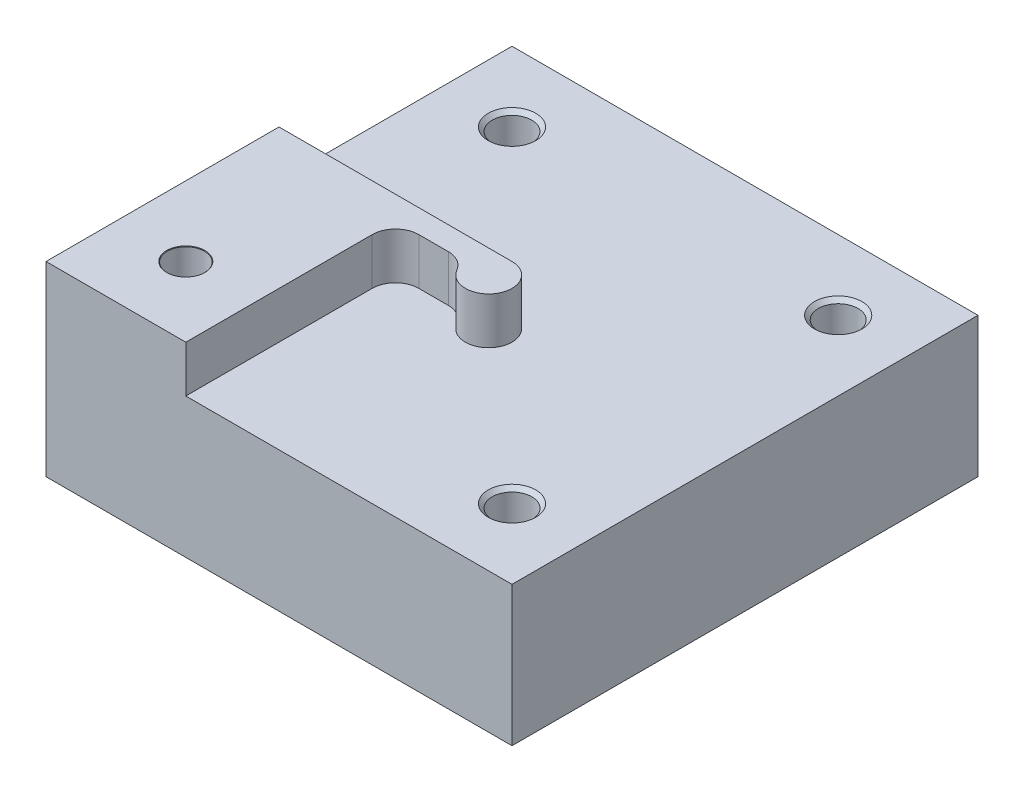
ISO-10303-21;
HEADER;
FILE_DESCRIPTION(('STEP AP214'),'2;1');
FILE_NAME('part.step','',(''),(''),'','','');
FILE_SCHEMA(('AUTOMOTIVE_DESIGN { 1 0 10303 214 1 1 1 1 }'));
ENDSEC;
DATA;
#1=APPLICATION_CONTEXT('core data for automotive mechanical design processes');
#2=APPLICATION_PROTOCOL_DEFINITION('international standard','automotive_design',2000,#1);
#3=PRODUCT_CONTEXT('',#1,'mechanical');
#4=PRODUCT('Part','Part','',(#3));
#5=PRODUCT_RELATED_PRODUCT_CATEGORY('part','',(#4));
#6=PRODUCT_DEFINITION_FORMATION('','',#4);
#7=PRODUCT_DEFINITION_CONTEXT('part definition',#1,'design');
#8=PRODUCT_DEFINITION('design','',#6,#7);
#9=PRODUCT_DEFINITION_SHAPE('','',#8);
#10=(LENGTH_UNIT() NAMED_UNIT(*) SI_UNIT(.MILLI.,.METRE.));
#11=(NAMED_UNIT(*) PLANE_ANGLE_UNIT() SI_UNIT($,.RADIAN.));
#12=(NAMED_UNIT(*) SI_UNIT($,.STERADIAN.) SOLID_ANGLE_UNIT());
#13=UNCERTAINTY_MEASURE_WITH_UNIT(LENGTH_MEASURE(1.E-05),#10,'distance_accuracy_value','');
#14=(GEOMETRIC_REPRESENTATION_CONTEXT(3) GLOBAL_UNCERTAINTY_ASSIGNED_CONTEXT((#13)) GLOBAL_UNIT_ASSIGNED_CONTEXT((#10,
#11,#12)) REPRESENTATION_CONTEXT('',''));
#15=CARTESIAN_POINT('',(0.,0.,0.));
#16=DIRECTION('',(0.,0.,1.));
#17=DIRECTION('',(1.,0.,0.));
#18=AXIS2_PLACEMENT_3D('',#15,#16,#17);
#19=CARTESIAN_POINT('',(-50.,30.,-50.));
#20=DIRECTION('',(1.,0.,0.));
#21=DIRECTION('',(0.,0.,-1.));
#22=AXIS2_PLACEMENT_3D('',#19,#20,#21);
#23=PLANE('',#22);
#24=DIRECTION('',(0.,0.,1.));
#25=VECTOR('',#24,1.);
#26=CARTESIAN_POINT('',(-50.,0.,-50.));
#27=LINE('',#26,#25);
#28=CARTESIAN_POINT('',(-50.,0.,-50.));
#29=VERTEX_POINT('',#28);
#30=CARTESIAN_POINT('',(-50.,0.,50.));
#31=VERTEX_POINT('',#30);
#32=EDGE_CURVE('E143',#29,#31,#27,.T.);
#33=ORIENTED_EDGE('',*,*,#32,.T.);
#34=DIRECTION('',(0.,-1.,0.));
#35=VECTOR('',#34,1.);
#36=CARTESIAN_POINT('',(-50.,30.,50.));
#37=LINE('',#36,#35);
#38=CARTESIAN_POINT('',(-50.,40.,50.));
#39=VERTEX_POINT('',#38);
#40=EDGE_CURVE('E173',#39,#31,#37,.T.);
#41=ORIENTED_EDGE('',*,*,#40,.F.);
#42=DIRECTION('',(0.,0.,1.));
#43=VECTOR('',#42,1.);
#44=CARTESIAN_POINT('',(-50.,40.,50.));
#45=LINE('',#44,#43);
#46=CARTESIAN_POINT('',(-50.,40.,0.));
#47=VERTEX_POINT('',#46);
#48=EDGE_CURVE('E135',#47,#39,#45,.T.);
#49=ORIENTED_EDGE('',*,*,#48,.F.);
#50=DIRECTION('',(0.,-1.,0.));
#51=VECTOR('',#50,1.);
#52=CARTESIAN_POINT('',(-50.,40.,0.));
#53=LINE('',#52,#51);
#54=CARTESIAN_POINT('',(-50.,30.,0.));
#55=VERTEX_POINT('',#54);
#56=EDGE_CURVE('E267',#47,#55,#53,.T.);
#57=ORIENTED_EDGE('',*,*,#56,.T.);
#58=DIRECTION('',(0.,0.,1.));
#59=VECTOR('',#58,1.);
#60=CARTESIAN_POINT('',(-50.,30.,-50.));
#61=LINE('',#60,#59);
#62=CARTESIAN_POINT('',(-50.,30.,-50.));
#63=VERTEX_POINT('',#62);
#64=EDGE_CURVE('E152',#63,#55,#61,.T.);
#65=ORIENTED_EDGE('',*,*,#64,.F.);
#66=DIRECTION('',(0.,-1.,0.));
#67=VECTOR('',#66,1.);
#68=CARTESIAN_POINT('',(-50.,30.,-50.));
#69=LINE('',#68,#67);
#70=EDGE_CURVE('E159',#63,#29,#69,.T.);
#71=ORIENTED_EDGE('',*,*,#70,.T.);
#72=EDGE_LOOP('',(#33,#41,#49,#57,#65,#71));
#73=FACE_BOUND('',#72,.T.);
#74=ADVANCED_FACE('F37',(#73),#23,.F.);
#75=CARTESIAN_POINT('',(-50.,30.,50.));
#76=DIRECTION('',(0.,0.,-1.));
#77=DIRECTION('',(-1.,0.,0.));
#78=AXIS2_PLACEMENT_3D('',#75,#76,#77);
#79=PLANE('',#78);
#80=DIRECTION('',(1.,0.,0.));
#81=VECTOR('',#80,1.);
#82=CARTESIAN_POINT('',(-50.,0.,50.));
#83=LINE('',#82,#81);
#84=CARTESIAN_POINT('',(50.,0.,50.));
#85=VERTEX_POINT('',#84);
#86=EDGE_CURVE('E146',#31,#85,#83,.T.);
#87=ORIENTED_EDGE('',*,*,#86,.T.);
#88=DIRECTION('',(0.,-1.,0.));
#89=VECTOR('',#88,1.);
#90=CARTESIAN_POINT('',(50.,30.,50.));
#91=LINE('',#90,#89);
#92=CARTESIAN_POINT('',(50.,30.,50.));
#93=VERTEX_POINT('',#92);
#94=EDGE_CURVE('E170',#93,#85,#91,.T.);
#95=ORIENTED_EDGE('',*,*,#94,.F.);
#96=DIRECTION('',(1.,0.,0.));
#97=VECTOR('',#96,1.);
#98=CARTESIAN_POINT('',(-50.,30.,50.));
#99=LINE('',#98,#97);
#100=CARTESIAN_POINT('',(-20.,30.,50.));
#101=VERTEX_POINT('',#100);
#102=EDGE_CURVE('E142',#101,#93,#99,.T.);
#103=ORIENTED_EDGE('',*,*,#102,.F.);
#104=DIRECTION('',(0.,-1.,0.));
#105=VECTOR('',#104,1.);
#106=CARTESIAN_POINT('',(-20.,40.,50.));
#107=LINE('',#106,#105);
#108=CARTESIAN_POINT('',(-20.,40.,50.));
#109=VERTEX_POINT('',#108);
#110=EDGE_CURVE('E123',#109,#101,#107,.T.);
#111=ORIENTED_EDGE('',*,*,#110,.F.);
#112=DIRECTION('',(1.,0.,0.));
#113=VECTOR('',#112,1.);
#114=CARTESIAN_POINT('',(-20.,40.,50.));
#115=LINE('',#114,#113);
#116=EDGE_CURVE('E129',#39,#109,#115,.T.);
#117=ORIENTED_EDGE('',*,*,#116,.F.);
#118=ORIENTED_EDGE('',*,*,#40,.T.);
#119=EDGE_LOOP('',(#87,#95,#103,#111,#117,#118));
#120=FACE_BOUND('',#119,.T.);
#121=ADVANCED_FACE('F140',(#120),#79,.F.);
#122=CARTESIAN_POINT('',(50.,30.,-50.));
#123=DIRECTION('',(-1.,0.,0.));
#124=DIRECTION('',(0.,0.,1.));
#125=AXIS2_PLACEMENT_3D('',#122,#123,#124);
#126=PLANE('',#125);
#127=DIRECTION('',(0.,0.,-1.));
#128=VECTOR('',#127,1.);
#129=CARTESIAN_POINT('',(50.,0.,-50.));
#130=LINE('',#129,#128);
#131=CARTESIAN_POINT('',(50.,0.,-50.));
#132=VERTEX_POINT('',#131);
#133=EDGE_CURVE('E162',#85,#132,#130,.T.);
#134=ORIENTED_EDGE('',*,*,#133,.T.);
#135=DIRECTION('',(0.,-1.,0.));
#136=VECTOR('',#135,1.);
#137=CARTESIAN_POINT('',(50.,30.,-50.));
#138=LINE('',#137,#136);
#139=CARTESIAN_POINT('',(50.,30.,-50.));
#140=VERTEX_POINT('',#139);
#141=EDGE_CURVE('E167',#140,#132,#138,.T.);
#142=ORIENTED_EDGE('',*,*,#141,.F.);
#143=DIRECTION('',(0.,0.,-1.));
#144=VECTOR('',#143,1.);
#145=CARTESIAN_POINT('',(50.,30.,-50.));
#146=LINE('',#145,#144);
#147=EDGE_CURVE('E156',#93,#140,#146,.T.);
#148=ORIENTED_EDGE('',*,*,#147,.F.);
#149=ORIENTED_EDGE('',*,*,#94,.T.);
#150=EDGE_LOOP('',(#134,#142,#148,#149));
#151=FACE_BOUND('',#150,.T.);
#152=ADVANCED_FACE('F213',(#151),#126,.F.);
#153=CARTESIAN_POINT('',(-50.,30.,-50.));
#154=DIRECTION('',(0.,0.,1.));
#155=DIRECTION('',(1.,0.,0.));
#156=AXIS2_PLACEMENT_3D('',#153,#154,#155);
#157=PLANE('',#156);
#158=DIRECTION('',(-1.,0.,0.));
#159=VECTOR('',#158,1.);
#160=CARTESIAN_POINT('',(-50.,0.,-50.));
#161=LINE('',#160,#159);
#162=EDGE_CURVE('E154',#132,#29,#161,.T.);
#163=ORIENTED_EDGE('',*,*,#162,.T.);
#164=ORIENTED_EDGE('',*,*,#70,.F.);
#165=DIRECTION('',(-1.,0.,0.));
#166=VECTOR('',#165,1.);
#167=CARTESIAN_POINT('',(-50.,30.,-50.));
#168=LINE('',#167,#166);
#169=EDGE_CURVE('E158',#140,#63,#168,.T.);
#170=ORIENTED_EDGE('',*,*,#169,.F.);
#171=ORIENTED_EDGE('',*,*,#141,.T.);
#172=EDGE_LOOP('',(#163,#164,#170,#171));
#173=FACE_BOUND('',#172,.T.);
#174=ADVANCED_FACE('F321',(#173),#157,.F.);
#175=CARTESIAN_POINT('',(0.,30.,0.));
#176=DIRECTION('',(0.,1.,0.));
#177=DIRECTION('',(0.,0.,1.));
#178=AXIS2_PLACEMENT_3D('',#175,#176,#177);
#179=PLANE('',#178);
#180=CARTESIAN_POINT('',(35.,30.,35.));
#181=DIRECTION('',(0.,1.,0.));
#182=DIRECTION('',(0.,0.,1.));
#183=AXIS2_PLACEMENT_3D('',#180,#181,#182);
#184=CIRCLE('',#183,5.09999999999999);
#185=CARTESIAN_POINT('',(35.,30.,40.1));
#186=VERTEX_POINT('',#185);
#187=EDGE_CURVE('E184',#186,#186,#184,.F.);
#188=ORIENTED_EDGE('',*,*,#187,.T.);
#189=EDGE_LOOP('',(#188));
#190=FACE_BOUND('',#189,.T.);
#191=CARTESIAN_POINT('',(35.,30.,-35.));
#192=DIRECTION('',(0.,1.,0.));
#193=DIRECTION('',(0.,0.,1.));
#194=AXIS2_PLACEMENT_3D('',#191,#192,#193);
#195=CIRCLE('',#194,5.09999999999999);
#196=CARTESIAN_POINT('',(35.,30.,-29.9));
#197=VERTEX_POINT('',#196);
#198=EDGE_CURVE('E181',#197,#197,#195,.F.);
#199=ORIENTED_EDGE('',*,*,#198,.T.);
#200=EDGE_LOOP('',(#199));
#201=FACE_BOUND('',#200,.T.);
#202=CARTESIAN_POINT('',(-35.,30.,-35.));
#203=DIRECTION('',(0.,1.,0.));
#204=DIRECTION('',(0.,0.,1.));
#205=AXIS2_PLACEMENT_3D('',#202,#203,#204);
#206=CIRCLE('',#205,5.09999999999999);
#207=CARTESIAN_POINT('',(-35.,30.,-29.9));
#208=VERTEX_POINT('',#207);
#209=EDGE_CURVE('E178',#208,#208,#206,.F.);
#210=ORIENTED_EDGE('',*,*,#209,.T.);
#211=EDGE_LOOP('',(#210));
#212=FACE_BOUND('',#211,.T.);
#213=DIRECTION('',(-1.,0.,0.));
#214=VECTOR('',#213,1.);
#215=CARTESIAN_POINT('',(-50.,30.,0.));
#216=LINE('',#215,#214);
#217=CARTESIAN_POINT('',(0.,30.,0.));
#218=VERTEX_POINT('',#217);
#219=EDGE_CURVE('E52',#218,#55,#216,.T.);
#220=ORIENTED_EDGE('',*,*,#219,.F.);
#221=CARTESIAN_POINT('',(0.,30.,5.));
#222=DIRECTION('',(0.,1.,0.));
#223=DIRECTION('',(0.,0.,-1.));
#224=AXIS2_PLACEMENT_3D('',#221,#222,#223);
#225=CIRCLE('',#224,5.);
#226=CARTESIAN_POINT('',(-4.3301270189222,30.,7.5));
#227=VERTEX_POINT('',#226);
#228=EDGE_CURVE('E56',#227,#218,#225,.T.);
#229=ORIENTED_EDGE('',*,*,#228,.F.);
#230=CARTESIAN_POINT('',(-8.66025403784439,30.,10.));
#231=DIRECTION('',(0.,-1.,0.));
#232=DIRECTION('',(0.,0.,1.));
#233=AXIS2_PLACEMENT_3D('',#230,#231,#232);
#234=CIRCLE('',#233,5.);
#235=CARTESIAN_POINT('',(-8.66025403784439,30.,5.));
#236=VERTEX_POINT('',#235);
#237=EDGE_CURVE('E275',#236,#227,#234,.T.);
#238=ORIENTED_EDGE('',*,*,#237,.F.);
#239=DIRECTION('',(1.,0.,0.));
#240=VECTOR('',#239,1.);
#241=CARTESIAN_POINT('',(-8.66025403784439,30.,5.));
#242=LINE('',#241,#240);
#243=CARTESIAN_POINT('',(-15.,30.,5.));
#244=VERTEX_POINT('',#243);
#245=EDGE_CURVE('E272',#244,#236,#242,.T.);
#246=ORIENTED_EDGE('',*,*,#245,.F.);
#247=CARTESIAN_POINT('',(-15.,30.,10.));
#248=DIRECTION('',(0.,-1.,0.));
#249=DIRECTION('',(0.,0.,1.));
#250=AXIS2_PLACEMENT_3D('',#247,#248,#249);
#251=CIRCLE('',#250,5.);
#252=CARTESIAN_POINT('',(-20.,30.,10.));
#253=VERTEX_POINT('',#252);
#254=EDGE_CURVE('E269',#253,#244,#251,.T.);
#255=ORIENTED_EDGE('',*,*,#254,.F.);
#256=DIRECTION('',(0.,0.,-1.));
#257=VECTOR('',#256,1.);
#258=CARTESIAN_POINT('',(-20.,30.,10.));
#259=LINE('',#258,#257);
#260=EDGE_CURVE('E250',#101,#253,#259,.T.);
#261=ORIENTED_EDGE('',*,*,#260,.F.);
#262=ORIENTED_EDGE('',*,*,#102,.T.);
#263=ORIENTED_EDGE('',*,*,#147,.T.);
#264=ORIENTED_EDGE('',*,*,#169,.T.);
#265=ORIENTED_EDGE('',*,*,#64,.T.);
#266=EDGE_LOOP('',(#220,#229,#238,#246,#255,#261,#262,#263,#264,#265));
#267=FACE_BOUND('',#266,.T.);
#268=ADVANCED_FACE('F297',(#190,#201,#212,#267),#179,.T.);
#269=CARTESIAN_POINT('',(0.,0.,0.));
#270=DIRECTION('',(0.,1.,0.));
#271=DIRECTION('',(0.,0.,1.));
#272=AXIS2_PLACEMENT_3D('',#269,#270,#271);
#273=PLANE('',#272);
#274=ORIENTED_EDGE('',*,*,#32,.F.);
#275=ORIENTED_EDGE('',*,*,#162,.F.);
#276=ORIENTED_EDGE('',*,*,#133,.F.);
#277=ORIENTED_EDGE('',*,*,#86,.F.);
#278=EDGE_LOOP('',(#274,#275,#276,#277));
#279=FACE_BOUND('',#278,.T.);
#280=ADVANCED_FACE('F318',(#279),#273,.F.);
#281=CARTESIAN_POINT('',(-20.,40.,10.));
#282=DIRECTION('',(-1.,0.,0.));
#283=DIRECTION('',(0.,0.,1.));
#284=AXIS2_PLACEMENT_3D('',#281,#282,#283);
#285=PLANE('',#284);
#286=ORIENTED_EDGE('',*,*,#260,.T.);
#287=DIRECTION('',(0.,-1.,0.));
#288=VECTOR('',#287,1.);
#289=CARTESIAN_POINT('',(-20.,40.,10.));
#290=LINE('',#289,#288);
#291=CARTESIAN_POINT('',(-20.,40.,10.));
#292=VERTEX_POINT('',#291);
#293=EDGE_CURVE('E125',#292,#253,#290,.T.);
#294=ORIENTED_EDGE('',*,*,#293,.F.);
#295=DIRECTION('',(0.,0.,-1.));
#296=VECTOR('',#295,1.);
#297=CARTESIAN_POINT('',(-20.,40.,10.));
#298=LINE('',#297,#296);
#299=EDGE_CURVE('E118',#109,#292,#298,.T.);
#300=ORIENTED_EDGE('',*,*,#299,.F.);
#301=ORIENTED_EDGE('',*,*,#110,.T.);
#302=EDGE_LOOP('',(#286,#294,#300,#301));
#303=FACE_BOUND('',#302,.T.);
#304=ADVANCED_FACE('F121',(#303),#285,.F.);
#305=CARTESIAN_POINT('',(-15.,40.,10.));
#306=DIRECTION('',(0.,-1.,0.));
#307=DIRECTION('',(0.,0.,-1.));
#308=AXIS2_PLACEMENT_3D('',#305,#306,#307);
#309=CYLINDRICAL_SURFACE('',#308,5.);
#310=ORIENTED_EDGE('',*,*,#254,.T.);
#311=DIRECTION('',(0.,-1.,0.));
#312=VECTOR('',#311,1.);
#313=CARTESIAN_POINT('',(-15.,40.,5.));
#314=LINE('',#313,#312);
#315=CARTESIAN_POINT('',(-15.,40.,5.));
#316=VERTEX_POINT('',#315);
#317=EDGE_CURVE('E148',#316,#244,#314,.T.);
#318=ORIENTED_EDGE('',*,*,#317,.F.);
#319=CARTESIAN_POINT('',(-15.,40.,10.));
#320=DIRECTION('',(0.,-1.,0.));
#321=DIRECTION('',(0.,0.,1.));
#322=AXIS2_PLACEMENT_3D('',#319,#320,#321);
#323=CIRCLE('',#322,5.);
#324=EDGE_CURVE('E128',#292,#316,#323,.T.);
#325=ORIENTED_EDGE('',*,*,#324,.F.);
#326=ORIENTED_EDGE('',*,*,#293,.T.);
#327=EDGE_LOOP('',(#310,#318,#325,#326));
#328=FACE_BOUND('',#327,.T.);
#329=ADVANCED_FACE('F296',(#328),#309,.F.);
#330=CARTESIAN_POINT('',(-8.66025403784439,40.,5.));
#331=DIRECTION('',(0.,0.,-1.));
#332=DIRECTION('',(-1.,0.,0.));
#333=AXIS2_PLACEMENT_3D('',#330,#331,#332);
#334=PLANE('',#333);
#335=ORIENTED_EDGE('',*,*,#245,.T.);
#336=DIRECTION('',(0.,-1.,0.));
#337=VECTOR('',#336,1.);
#338=CARTESIAN_POINT('',(-8.66025403784439,40.,5.));
#339=LINE('',#338,#337);
#340=CARTESIAN_POINT('',(-8.66025403784439,40.,5.));
#341=VERTEX_POINT('',#340);
#342=EDGE_CURVE('E287',#341,#236,#339,.T.);
#343=ORIENTED_EDGE('',*,*,#342,.F.);
#344=DIRECTION('',(1.,0.,0.));
#345=VECTOR('',#344,1.);
#346=CARTESIAN_POINT('',(-8.66025403784439,40.,5.));
#347=LINE('',#346,#345);
#348=EDGE_CURVE('E258',#316,#341,#347,.T.);
#349=ORIENTED_EDGE('',*,*,#348,.F.);
#350=ORIENTED_EDGE('',*,*,#317,.T.);
#351=EDGE_LOOP('',(#335,#343,#349,#350));
#352=FACE_BOUND('',#351,.T.);
#353=ADVANCED_FACE('F293',(#352),#334,.F.);
#354=CARTESIAN_POINT('',(-8.66025403784439,40.,10.));
#355=DIRECTION('',(0.,-1.,0.));
#356=DIRECTION('',(0.,0.,-1.));
#357=AXIS2_PLACEMENT_3D('',#354,#355,#356);
#358=CYLINDRICAL_SURFACE('',#357,5.);
#359=ORIENTED_EDGE('',*,*,#237,.T.);
#360=DIRECTION('',(0.,-1.,0.));
#361=VECTOR('',#360,1.);
#362=CARTESIAN_POINT('',(-4.3301270189222,40.,7.5));
#363=LINE('',#362,#361);
#364=CARTESIAN_POINT('',(-4.3301270189222,40.,7.5));
#365=VERTEX_POINT('',#364);
#366=EDGE_CURVE('E284',#365,#227,#363,.T.);
#367=ORIENTED_EDGE('',*,*,#366,.F.);
#368=CARTESIAN_POINT('',(-8.66025403784439,40.,10.));
#369=DIRECTION('',(0.,-1.,0.));
#370=DIRECTION('',(0.,0.,1.));
#371=AXIS2_PLACEMENT_3D('',#368,#369,#370);
#372=CIRCLE('',#371,5.);
#373=EDGE_CURVE('E260',#341,#365,#372,.T.);
#374=ORIENTED_EDGE('',*,*,#373,.F.);
#375=ORIENTED_EDGE('',*,*,#342,.T.);
#376=EDGE_LOOP('',(#359,#367,#374,#375));
#377=FACE_BOUND('',#376,.T.);
#378=ADVANCED_FACE('F300',(#377),#358,.F.);
#379=CARTESIAN_POINT('',(0.,40.,5.));
#380=DIRECTION('',(0.,-1.,0.));
#381=DIRECTION('',(0.,0.,-1.));
#382=AXIS2_PLACEMENT_3D('',#379,#380,#381);
#383=CYLINDRICAL_SURFACE('',#382,5.);
#384=ORIENTED_EDGE('',*,*,#228,.T.);
#385=DIRECTION('',(0.,-1.,0.));
#386=VECTOR('',#385,1.);
#387=CARTESIAN_POINT('',(0.,40.,0.));
#388=LINE('',#387,#386);
#389=CARTESIAN_POINT('',(0.,40.,0.));
#390=VERTEX_POINT('',#389);
#391=EDGE_CURVE('E281',#390,#218,#388,.T.);
#392=ORIENTED_EDGE('',*,*,#391,.F.);
#393=CARTESIAN_POINT('',(0.,40.,5.));
#394=DIRECTION('',(0.,1.,0.));
#395=DIRECTION('',(0.,0.,-1.));
#396=AXIS2_PLACEMENT_3D('',#393,#394,#395);
#397=CIRCLE('',#396,5.);
#398=EDGE_CURVE('E262',#365,#390,#397,.T.);
#399=ORIENTED_EDGE('',*,*,#398,.F.);
#400=ORIENTED_EDGE('',*,*,#366,.T.);
#401=EDGE_LOOP('',(#384,#392,#399,#400));
#402=FACE_BOUND('',#401,.T.);
#403=ADVANCED_FACE('F304',(#402),#383,.T.);
#404=CARTESIAN_POINT('',(-50.,40.,0.));
#405=DIRECTION('',(0.,0.,1.));
#406=DIRECTION('',(1.,0.,0.));
#407=AXIS2_PLACEMENT_3D('',#404,#405,#406);
#408=PLANE('',#407);
#409=ORIENTED_EDGE('',*,*,#219,.T.);
#410=ORIENTED_EDGE('',*,*,#56,.F.);
#411=DIRECTION('',(-1.,0.,0.));
#412=VECTOR('',#411,1.);
#413=CARTESIAN_POINT('',(-50.,40.,0.));
#414=LINE('',#413,#412);
#415=EDGE_CURVE('E264',#390,#47,#414,.T.);
#416=ORIENTED_EDGE('',*,*,#415,.F.);
#417=ORIENTED_EDGE('',*,*,#391,.T.);
#418=EDGE_LOOP('',(#409,#410,#416,#417));
#419=FACE_BOUND('',#418,.T.);
#420=ADVANCED_FACE('F309',(#419),#408,.F.);
#421=CARTESIAN_POINT('',(0.,40.,5.));
#422=DIRECTION('',(0.,-1.,0.));
#423=DIRECTION('',(0.,0.,-1.));
#424=AXIS2_PLACEMENT_3D('',#421,#422,#423);
#425=PLANE('',#424);
#426=CARTESIAN_POINT('',(-35.,40.,35.));
#427=DIRECTION('',(0.,-1.,0.));
#428=DIRECTION('',(0.,0.,-1.));
#429=AXIS2_PLACEMENT_3D('',#426,#427,#428);
#430=CIRCLE('',#429,4.10000000000001);
#431=CARTESIAN_POINT('',(-35.,40.,30.9));
#432=VERTEX_POINT('',#431);
#433=EDGE_CURVE('E11',#432,#432,#430,.T.);
#434=ORIENTED_EDGE('',*,*,#433,.T.);
#435=EDGE_LOOP('',(#434));
#436=FACE_BOUND('',#435,.T.);
#437=ORIENTED_EDGE('',*,*,#116,.T.);
#438=ORIENTED_EDGE('',*,*,#299,.T.);
#439=ORIENTED_EDGE('',*,*,#324,.T.);
#440=ORIENTED_EDGE('',*,*,#348,.T.);
#441=ORIENTED_EDGE('',*,*,#373,.T.);
#442=ORIENTED_EDGE('',*,*,#398,.T.);
#443=ORIENTED_EDGE('',*,*,#415,.T.);
#444=ORIENTED_EDGE('',*,*,#48,.T.);
#445=EDGE_LOOP('',(#437,#438,#439,#440,#441,#442,#443,#444));
#446=FACE_BOUND('',#445,.T.);
#447=ADVANCED_FACE('F133',(#436,#446),#425,.F.);
#448=CARTESIAN_POINT('',(35.,15.,-35.));
#449=DIRECTION('',(0.,1.,0.));
#450=DIRECTION('',(0.,0.,1.));
#451=AXIS2_PLACEMENT_3D('',#448,#449,#450);
#452=CYLINDRICAL_SURFACE('',#451,4.25000000000001);
#453=CARTESIAN_POINT('',(35.,29.15,-35.));
#454=DIRECTION('',(0.,1.,0.));
#455=DIRECTION('',(0.,0.,1.));
#456=AXIS2_PLACEMENT_3D('',#453,#454,#455);
#457=CIRCLE('',#456,4.25000000000001);
#458=CARTESIAN_POINT('',(35.,29.15,-30.75));
#459=VERTEX_POINT('',#458);
#460=EDGE_CURVE('E187',#459,#459,#457,.T.);
#461=ORIENTED_EDGE('',*,*,#460,.T.);
#462=EDGE_LOOP('',(#461));
#463=FACE_BOUND('',#462,.T.);
#464=CARTESIAN_POINT('',(35.,15.,-35.));
#465=DIRECTION('',(0.,1.,0.));
#466=DIRECTION('',(0.,0.,1.));
#467=AXIS2_PLACEMENT_3D('',#464,#465,#466);
#468=CIRCLE('',#467,4.25000000000001);
#469=CARTESIAN_POINT('',(35.,15.,-30.75));
#470=VERTEX_POINT('',#469);
#471=EDGE_CURVE('E246',#470,#470,#468,.T.);
#472=ORIENTED_EDGE('',*,*,#471,.F.);
#473=EDGE_LOOP('',(#472));
#474=FACE_BOUND('',#473,.T.);
#475=ADVANCED_FACE('F348',(#463,#474),#452,.F.);
#476=CARTESIAN_POINT('',(35.,15.,-35.));
#477=DIRECTION('',(0.,1.,0.));
#478=DIRECTION('',(0.,0.,1.));
#479=AXIS2_PLACEMENT_3D('',#476,#477,#478);
#480=PLANE('',#479);
#481=ORIENTED_EDGE('',*,*,#471,.T.);
#482=EDGE_LOOP('',(#481));
#483=FACE_BOUND('',#482,.T.);
#484=ADVANCED_FACE('F240',(#483),#480,.T.);
#485=CARTESIAN_POINT('',(-35.,15.,-35.));
#486=DIRECTION('',(0.,1.,0.));
#487=DIRECTION('',(0.,0.,1.));
#488=AXIS2_PLACEMENT_3D('',#485,#486,#487);
#489=CYLINDRICAL_SURFACE('',#488,4.25);
#490=CARTESIAN_POINT('',(-35.,29.15,-35.));
#491=DIRECTION('',(0.,1.,0.));
#492=DIRECTION('',(0.,0.,1.));
#493=AXIS2_PLACEMENT_3D('',#490,#491,#492);
#494=CIRCLE('',#493,4.25);
#495=CARTESIAN_POINT('',(-35.,29.15,-30.75));
#496=VERTEX_POINT('',#495);
#497=EDGE_CURVE('E190',#496,#496,#494,.T.);
#498=ORIENTED_EDGE('',*,*,#497,.T.);
#499=EDGE_LOOP('',(#498));
#500=FACE_BOUND('',#499,.T.);
#501=CARTESIAN_POINT('',(-35.,15.,-35.));
#502=DIRECTION('',(0.,1.,0.));
#503=DIRECTION('',(0.,0.,1.));
#504=AXIS2_PLACEMENT_3D('',#501,#502,#503);
#505=CIRCLE('',#504,4.25);
#506=CARTESIAN_POINT('',(-35.,15.,-30.75));
#507=VERTEX_POINT('',#506);
#508=EDGE_CURVE('E244',#507,#507,#505,.T.);
#509=ORIENTED_EDGE('',*,*,#508,.F.);
#510=EDGE_LOOP('',(#509));
#511=FACE_BOUND('',#510,.T.);
#512=ADVANCED_FACE('F236',(#500,#511),#489,.F.);
#513=CARTESIAN_POINT('',(-35.,15.,-35.));
#514=DIRECTION('',(0.,1.,0.));
#515=DIRECTION('',(0.,0.,1.));
#516=AXIS2_PLACEMENT_3D('',#513,#514,#515);
#517=PLANE('',#516);
#518=ORIENTED_EDGE('',*,*,#508,.T.);
#519=EDGE_LOOP('',(#518));
#520=FACE_BOUND('',#519,.T.);
#521=ADVANCED_FACE('F239',(#520),#517,.T.);
#522=CARTESIAN_POINT('',(35.,15.,35.));
#523=DIRECTION('',(0.,1.,0.));
#524=DIRECTION('',(0.,0.,1.));
#525=AXIS2_PLACEMENT_3D('',#522,#523,#524);
#526=CYLINDRICAL_SURFACE('',#525,4.25000000000001);
#527=CARTESIAN_POINT('',(35.,29.15,35.));
#528=DIRECTION('',(0.,1.,0.));
#529=DIRECTION('',(0.,0.,1.));
#530=AXIS2_PLACEMENT_3D('',#527,#528,#529);
#531=CIRCLE('',#530,4.25000000000001);
#532=CARTESIAN_POINT('',(35.,29.15,39.25));
#533=VERTEX_POINT('',#532);
#534=EDGE_CURVE('E175',#533,#533,#531,.T.);
#535=ORIENTED_EDGE('',*,*,#534,.T.);
#536=EDGE_LOOP('',(#535));
#537=FACE_BOUND('',#536,.T.);
#538=CARTESIAN_POINT('',(35.,15.,35.));
#539=DIRECTION('',(0.,1.,0.));
#540=DIRECTION('',(0.,0.,1.));
#541=AXIS2_PLACEMENT_3D('',#538,#539,#540);
#542=CIRCLE('',#541,4.25000000000001);
#543=CARTESIAN_POINT('',(35.,15.,39.25));
#544=VERTEX_POINT('',#543);
#545=EDGE_CURVE('E247',#544,#544,#542,.T.);
#546=ORIENTED_EDGE('',*,*,#545,.F.);
#547=EDGE_LOOP('',(#546));
#548=FACE_BOUND('',#547,.T.);
#549=ADVANCED_FACE('F356',(#537,#548),#526,.F.);
#550=CARTESIAN_POINT('',(35.,15.,35.));
#551=DIRECTION('',(0.,1.,0.));
#552=DIRECTION('',(0.,0.,1.));
#553=AXIS2_PLACEMENT_3D('',#550,#551,#552);
#554=PLANE('',#553);
#555=ORIENTED_EDGE('',*,*,#545,.T.);
#556=EDGE_LOOP('',(#555));
#557=FACE_BOUND('',#556,.T.);
#558=ADVANCED_FACE('F221',(#557),#554,.T.);
#559=CARTESIAN_POINT('',(35.,29.15,35.));
#560=DIRECTION('',(0.,1.,0.));
#561=DIRECTION('',(0.,0.,1.));
#562=AXIS2_PLACEMENT_3D('',#559,#560,#561);
#563=CONICAL_SURFACE('',#562,4.25000000000001,0.785398163397453);
#564=ORIENTED_EDGE('',*,*,#187,.F.);
#565=EDGE_LOOP('',(#564));
#566=FACE_BOUND('',#565,.T.);
#567=ORIENTED_EDGE('',*,*,#534,.F.);
#568=EDGE_LOOP('',(#567));
#569=FACE_BOUND('',#568,.T.);
#570=ADVANCED_FACE('F217',(#566,#569),#563,.F.);
#571=CARTESIAN_POINT('',(35.,29.15,-35.));
#572=DIRECTION('',(0.,1.,0.));
#573=DIRECTION('',(0.,0.,1.));
#574=AXIS2_PLACEMENT_3D('',#571,#572,#573);
#575=CONICAL_SURFACE('',#574,4.25000000000001,0.785398163397453);
#576=ORIENTED_EDGE('',*,*,#198,.F.);
#577=EDGE_LOOP('',(#576));
#578=FACE_BOUND('',#577,.T.);
#579=ORIENTED_EDGE('',*,*,#460,.F.);
#580=EDGE_LOOP('',(#579));
#581=FACE_BOUND('',#580,.T.);
#582=ADVANCED_FACE('F220',(#578,#581),#575,.F.);
#583=CARTESIAN_POINT('',(-35.,29.15,-35.));
#584=DIRECTION('',(0.,1.,0.));
#585=DIRECTION('',(0.,0.,1.));
#586=AXIS2_PLACEMENT_3D('',#583,#584,#585);
#587=CONICAL_SURFACE('',#586,4.25,0.785398163397453);
#588=ORIENTED_EDGE('',*,*,#209,.F.);
#589=EDGE_LOOP('',(#588));
#590=FACE_BOUND('',#589,.T.);
#591=ORIENTED_EDGE('',*,*,#497,.F.);
#592=EDGE_LOOP('',(#591));
#593=FACE_BOUND('',#592,.T.);
#594=ADVANCED_FACE('F224',(#590,#593),#587,.F.);
#595=CARTESIAN_POINT('',(-35.,25.,35.));
#596=DIRECTION('',(0.,1.,0.));
#597=DIRECTION('',(0.,0.,1.));
#598=AXIS2_PLACEMENT_3D('',#595,#596,#597);
#599=CYLINDRICAL_SURFACE('',#598,4.00000000000001);
#600=CARTESIAN_POINT('',(-35.,39.9,35.));
#601=DIRECTION('',(0.,-1.,0.));
#602=DIRECTION('',(0.,0.,-1.));
#603=AXIS2_PLACEMENT_3D('',#600,#601,#602);
#604=CIRCLE('',#603,4.00000000000001);
#605=CARTESIAN_POINT('',(-35.,39.9,31.));
#606=VERTEX_POINT('',#605);
#607=EDGE_CURVE('E45',#606,#606,#604,.F.);
#608=ORIENTED_EDGE('',*,*,#607,.T.);
#609=EDGE_LOOP('',(#608));
#610=FACE_BOUND('',#609,.T.);
#611=CARTESIAN_POINT('',(-35.,25.,35.));
#612=DIRECTION('',(0.,1.,0.));
#613=DIRECTION('',(0.,0.,1.));
#614=AXIS2_PLACEMENT_3D('',#611,#612,#613);
#615=CIRCLE('',#614,4.00000000000001);
#616=CARTESIAN_POINT('',(-35.,25.,39.));
#617=VERTEX_POINT('',#616);
#618=EDGE_CURVE('E253',#617,#617,#615,.T.);
#619=ORIENTED_EDGE('',*,*,#618,.F.);
#620=EDGE_LOOP('',(#619));
#621=FACE_BOUND('',#620,.T.);
#622=ADVANCED_FACE('F195',(#610,#621),#599,.F.);
#623=CARTESIAN_POINT('',(-35.,25.,35.));
#624=DIRECTION('',(0.,1.,0.));
#625=DIRECTION('',(0.,0.,1.));
#626=AXIS2_PLACEMENT_3D('',#623,#624,#625);
#627=PLANE('',#626);
#628=ORIENTED_EDGE('',*,*,#618,.T.);
#629=EDGE_LOOP('',(#628));
#630=FACE_BOUND('',#629,.T.);
#631=ADVANCED_FACE('F199',(#630),#627,.T.);
#632=CARTESIAN_POINT('',(-35.,39.9,35.));
#633=DIRECTION('',(0.,1.,0.));
#634=DIRECTION('',(0.,0.,1.));
#635=AXIS2_PLACEMENT_3D('',#632,#633,#634);
#636=CONICAL_SURFACE('',#635,4.00000000000001,0.785398163397431);
#637=ORIENTED_EDGE('',*,*,#433,.F.);
#638=EDGE_LOOP('',(#637));
#639=FACE_BOUND('',#638,.T.);
#640=ORIENTED_EDGE('',*,*,#607,.F.);
#641=EDGE_LOOP('',(#640));
#642=FACE_BOUND('',#641,.T.);
#643=ADVANCED_FACE('F39',(#639,#642),#636,.F.);
#644=CLOSED_SHELL('',(#74,#121,#152,#174,#268,#280,#304,#329,#353,#378,#403,#420,#447,#475,#484,
#512,#521,#549,#558,#570,#582,#594,#622,#631,#643));
#645=MANIFOLD_SOLID_BREP('B2',#644);
#646=ADVANCED_BREP_SHAPE_REPRESENTATION('',(#18,#645),#14);
#647=SHAPE_DEFINITION_REPRESENTATION(#9,#646);
ENDSEC;
END-ISO-10303-21;
